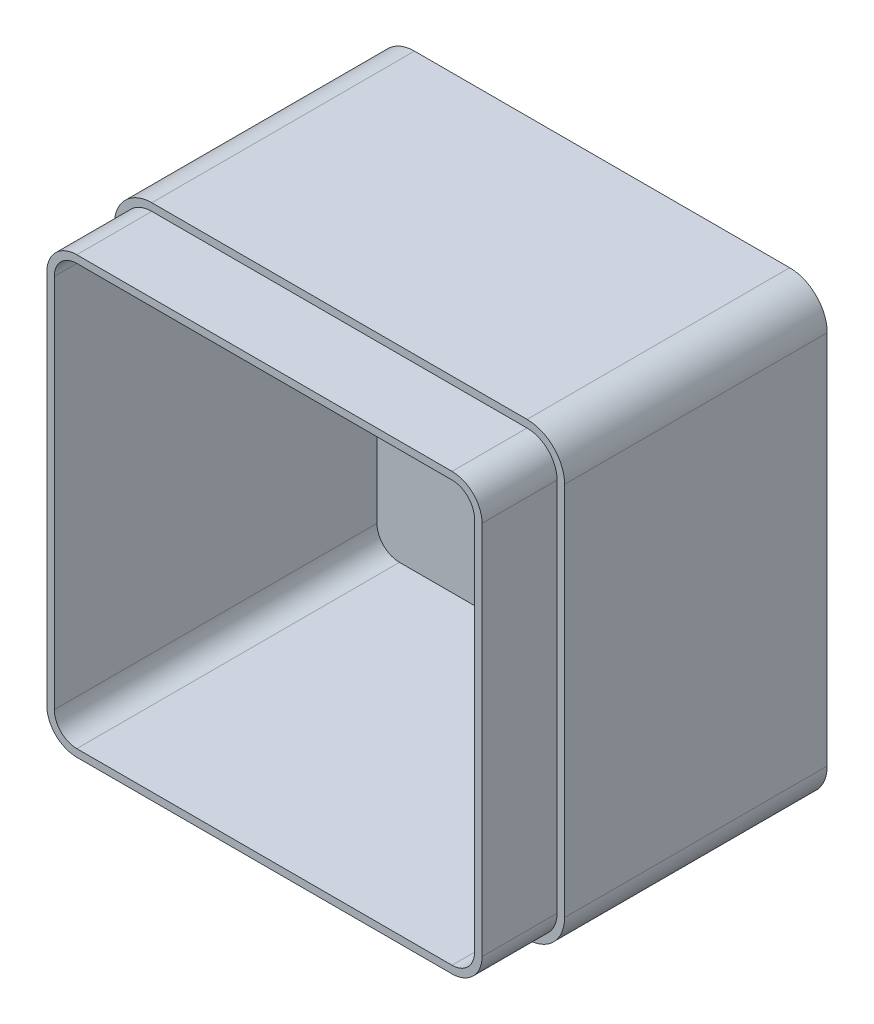
ISO-10303-21;
HEADER;
FILE_DESCRIPTION(('STEP AP214'),'2;1');
FILE_NAME('part.step','',(''),(''),'','','');
FILE_SCHEMA(('AUTOMOTIVE_DESIGN { 1 0 10303 214 1 1 1 1 }'));
ENDSEC;
DATA;
#1=APPLICATION_CONTEXT('core data for automotive mechanical design processes');
#2=APPLICATION_PROTOCOL_DEFINITION('international standard','automotive_design',2000,#1);
#3=PRODUCT_CONTEXT('',#1,'mechanical');
#4=PRODUCT('Part','Part','',(#3));
#5=PRODUCT_RELATED_PRODUCT_CATEGORY('part','',(#4));
#6=PRODUCT_DEFINITION_FORMATION('','',#4);
#7=PRODUCT_DEFINITION_CONTEXT('part definition',#1,'design');
#8=PRODUCT_DEFINITION('design','',#6,#7);
#9=PRODUCT_DEFINITION_SHAPE('','',#8);
#10=(LENGTH_UNIT() NAMED_UNIT(*) SI_UNIT(.MILLI.,.METRE.));
#11=(NAMED_UNIT(*) PLANE_ANGLE_UNIT() SI_UNIT($,.RADIAN.));
#12=(NAMED_UNIT(*) SI_UNIT($,.STERADIAN.) SOLID_ANGLE_UNIT());
#13=UNCERTAINTY_MEASURE_WITH_UNIT(LENGTH_MEASURE(1.E-05),#10,'distance_accuracy_value','');
#14=(GEOMETRIC_REPRESENTATION_CONTEXT(3) GLOBAL_UNCERTAINTY_ASSIGNED_CONTEXT((#13)) GLOBAL_UNIT_ASSIGNED_CONTEXT((#10,
#11,#12)) REPRESENTATION_CONTEXT('',''));
#15=CARTESIAN_POINT('',(0.,0.,0.));
#16=DIRECTION('',(0.,0.,1.));
#17=DIRECTION('',(1.,0.,0.));
#18=AXIS2_PLACEMENT_3D('',#15,#16,#17);
#19=CARTESIAN_POINT('',(0.,0.,90.));
#20=DIRECTION('',(0.,0.,-1.));
#21=DIRECTION('',(-1.,0.,0.));
#22=AXIS2_PLACEMENT_3D('',#19,#20,#21);
#23=PLANE('',#22);
#24=DIRECTION('',(0.,-1.,0.));
#25=VECTOR('',#24,1.);
#26=CARTESIAN_POINT('',(4.,0.,90.));
#27=LINE('',#26,#25);
#28=CARTESIAN_POINT('',(4.,110.,90.));
#29=VERTEX_POINT('',#28);
#30=CARTESIAN_POINT('',(4.,9.99999999999999,90.));
#31=VERTEX_POINT('',#30);
#32=EDGE_CURVE('E369',#29,#31,#27,.T.);
#33=ORIENTED_EDGE('',*,*,#32,.F.);
#34=CARTESIAN_POINT('',(10.,110.,90.));
#35=DIRECTION('',(0.,0.,-1.));
#36=DIRECTION('',(-1.,0.,0.));
#37=AXIS2_PLACEMENT_3D('',#34,#35,#36);
#38=CIRCLE('',#37,6.);
#39=CARTESIAN_POINT('',(9.99999999999999,116.,90.));
#40=VERTEX_POINT('',#39);
#41=EDGE_CURVE('E409',#40,#29,#38,.F.);
#42=ORIENTED_EDGE('',*,*,#41,.F.);
#43=DIRECTION('',(-1.,0.,0.));
#44=VECTOR('',#43,1.);
#45=CARTESIAN_POINT('',(0.,116.,90.));
#46=LINE('',#45,#44);
#47=CARTESIAN_POINT('',(110.,116.,90.));
#48=VERTEX_POINT('',#47);
#49=EDGE_CURVE('E385',#48,#40,#46,.T.);
#50=ORIENTED_EDGE('',*,*,#49,.F.);
#51=CARTESIAN_POINT('',(110.,110.,90.));
#52=DIRECTION('',(0.,0.,-1.));
#53=DIRECTION('',(-1.,0.,0.));
#54=AXIS2_PLACEMENT_3D('',#51,#52,#53);
#55=CIRCLE('',#54,6.);
#56=CARTESIAN_POINT('',(116.,110.,90.));
#57=VERTEX_POINT('',#56);
#58=EDGE_CURVE('E416',#57,#48,#55,.F.);
#59=ORIENTED_EDGE('',*,*,#58,.F.);
#60=DIRECTION('',(0.,1.,0.));
#61=VECTOR('',#60,1.);
#62=CARTESIAN_POINT('',(116.,0.,90.));
#63=LINE('',#62,#61);
#64=CARTESIAN_POINT('',(116.,9.99999999999999,90.));
#65=VERTEX_POINT('',#64);
#66=EDGE_CURVE('E413',#65,#57,#63,.T.);
#67=ORIENTED_EDGE('',*,*,#66,.F.);
#68=CARTESIAN_POINT('',(110.,10.,90.));
#69=DIRECTION('',(0.,0.,-1.));
#70=DIRECTION('',(-1.,0.,0.));
#71=AXIS2_PLACEMENT_3D('',#68,#69,#70);
#72=CIRCLE('',#71,6.);
#73=CARTESIAN_POINT('',(110.,4.,90.));
#74=VERTEX_POINT('',#73);
#75=EDGE_CURVE('E349',#74,#65,#72,.F.);
#76=ORIENTED_EDGE('',*,*,#75,.F.);
#77=DIRECTION('',(1.,0.,0.));
#78=VECTOR('',#77,1.);
#79=CARTESIAN_POINT('',(0.,4.,90.));
#80=LINE('',#79,#78);
#81=CARTESIAN_POINT('',(9.99999999999999,4.,90.));
#82=VERTEX_POINT('',#81);
#83=EDGE_CURVE('E406',#82,#74,#80,.T.);
#84=ORIENTED_EDGE('',*,*,#83,.F.);
#85=CARTESIAN_POINT('',(10.,10.,90.));
#86=DIRECTION('',(0.,0.,-1.));
#87=DIRECTION('',(-1.,0.,0.));
#88=AXIS2_PLACEMENT_3D('',#85,#86,#87);
#89=CIRCLE('',#88,6.);
#90=EDGE_CURVE('E399',#31,#82,#89,.F.);
#91=ORIENTED_EDGE('',*,*,#90,.F.);
#92=EDGE_LOOP('',(#33,#42,#50,#59,#67,#76,#84,#91));
#93=FACE_BOUND('',#92,.T.);
#94=CARTESIAN_POINT('',(10.,110.,90.));
#95=DIRECTION('',(0.,0.,1.));
#96=DIRECTION('',(1.,0.,0.));
#97=AXIS2_PLACEMENT_3D('',#94,#95,#96);
#98=CIRCLE('',#97,8.);
#99=CARTESIAN_POINT('',(9.99999999999999,118.,90.));
#100=VERTEX_POINT('',#99);
#101=CARTESIAN_POINT('',(2.,110.,90.));
#102=VERTEX_POINT('',#101);
#103=EDGE_CURVE('E277',#100,#102,#98,.T.);
#104=ORIENTED_EDGE('',*,*,#103,.T.);
#105=DIRECTION('',(0.,-1.,0.));
#106=VECTOR('',#105,1.);
#107=CARTESIAN_POINT('',(2.,110.,90.));
#108=LINE('',#107,#106);
#109=CARTESIAN_POINT('',(2.,9.99999999999999,90.));
#110=VERTEX_POINT('',#109);
#111=EDGE_CURVE('E227',#102,#110,#108,.T.);
#112=ORIENTED_EDGE('',*,*,#111,.T.);
#113=CARTESIAN_POINT('',(10.,10.,90.));
#114=DIRECTION('',(0.,0.,1.));
#115=DIRECTION('',(1.,0.,0.));
#116=AXIS2_PLACEMENT_3D('',#113,#114,#115);
#117=CIRCLE('',#116,8.);
#118=CARTESIAN_POINT('',(9.99999999999999,2.,90.));
#119=VERTEX_POINT('',#118);
#120=EDGE_CURVE('E75',#110,#119,#117,.T.);
#121=ORIENTED_EDGE('',*,*,#120,.T.);
#122=DIRECTION('',(1.,0.,0.));
#123=VECTOR('',#122,1.);
#124=CARTESIAN_POINT('',(10.,2.,90.));
#125=LINE('',#124,#123);
#126=CARTESIAN_POINT('',(110.,2.,90.));
#127=VERTEX_POINT('',#126);
#128=EDGE_CURVE('E284',#119,#127,#125,.T.);
#129=ORIENTED_EDGE('',*,*,#128,.T.);
#130=CARTESIAN_POINT('',(110.,10.,90.));
#131=DIRECTION('',(0.,0.,1.));
#132=DIRECTION('',(1.,0.,0.));
#133=AXIS2_PLACEMENT_3D('',#130,#131,#132);
#134=CIRCLE('',#133,7.99999999999999);
#135=CARTESIAN_POINT('',(118.,10.,90.));
#136=VERTEX_POINT('',#135);
#137=EDGE_CURVE('E288',#127,#136,#134,.T.);
#138=ORIENTED_EDGE('',*,*,#137,.T.);
#139=DIRECTION('',(0.,1.,0.));
#140=VECTOR('',#139,1.);
#141=CARTESIAN_POINT('',(118.,10.,90.));
#142=LINE('',#141,#140);
#143=CARTESIAN_POINT('',(118.,110.,90.));
#144=VERTEX_POINT('',#143);
#145=EDGE_CURVE('E292',#136,#144,#142,.T.);
#146=ORIENTED_EDGE('',*,*,#145,.T.);
#147=CARTESIAN_POINT('',(110.,110.,90.));
#148=DIRECTION('',(0.,0.,1.));
#149=DIRECTION('',(1.,0.,0.));
#150=AXIS2_PLACEMENT_3D('',#147,#148,#149);
#151=CIRCLE('',#150,7.99999999999999);
#152=CARTESIAN_POINT('',(110.,118.,90.));
#153=VERTEX_POINT('',#152);
#154=EDGE_CURVE('E254',#144,#153,#151,.T.);
#155=ORIENTED_EDGE('',*,*,#154,.T.);
#156=DIRECTION('',(-1.,0.,0.));
#157=VECTOR('',#156,1.);
#158=CARTESIAN_POINT('',(110.,118.,90.));
#159=LINE('',#158,#157);
#160=EDGE_CURVE('E250',#153,#100,#159,.T.);
#161=ORIENTED_EDGE('',*,*,#160,.T.);
#162=EDGE_LOOP('',(#104,#112,#121,#129,#138,#146,#155,#161));
#163=FACE_BOUND('',#162,.T.);
#164=ADVANCED_FACE('F59',(#93,#163),#23,.F.);
#165=CARTESIAN_POINT('',(4.,0.,90.));
#166=DIRECTION('',(1.,0.,0.));
#167=DIRECTION('',(0.,0.,-1.));
#168=AXIS2_PLACEMENT_3D('',#165,#166,#167);
#169=PLANE('',#168);
#170=DIRECTION('',(0.,-1.,0.));
#171=VECTOR('',#170,1.);
#172=CARTESIAN_POINT('',(4.,0.,4.));
#173=LINE('',#172,#171);
#174=CARTESIAN_POINT('',(4.,110.,4.));
#175=VERTEX_POINT('',#174);
#176=CARTESIAN_POINT('',(4.,9.99999999999999,4.));
#177=VERTEX_POINT('',#176);
#178=EDGE_CURVE('E341',#175,#177,#173,.T.);
#179=ORIENTED_EDGE('',*,*,#178,.F.);
#180=DIRECTION('',(0.,0.,-1.));
#181=VECTOR('',#180,1.);
#182=CARTESIAN_POINT('',(4.,110.,90.));
#183=LINE('',#182,#181);
#184=EDGE_CURVE('E350',#29,#175,#183,.T.);
#185=ORIENTED_EDGE('',*,*,#184,.F.);
#186=ORIENTED_EDGE('',*,*,#32,.T.);
#187=DIRECTION('',(0.,0.,-1.));
#188=VECTOR('',#187,1.);
#189=CARTESIAN_POINT('',(4.,9.99999999999999,90.));
#190=LINE('',#189,#188);
#191=EDGE_CURVE('E346',#177,#31,#190,.F.);
#192=ORIENTED_EDGE('',*,*,#191,.F.);
#193=EDGE_LOOP('',(#179,#185,#186,#192));
#194=FACE_BOUND('',#193,.T.);
#195=ADVANCED_FACE('F523',(#194),#169,.T.);
#196=CARTESIAN_POINT('',(0.,4.,90.));
#197=DIRECTION('',(0.,1.,0.));
#198=DIRECTION('',(0.,0.,1.));
#199=AXIS2_PLACEMENT_3D('',#196,#197,#198);
#200=PLANE('',#199);
#201=ORIENTED_EDGE('',*,*,#83,.T.);
#202=DIRECTION('',(0.,0.,1.));
#203=VECTOR('',#202,1.);
#204=CARTESIAN_POINT('',(110.,4.,90.));
#205=LINE('',#204,#203);
#206=CARTESIAN_POINT('',(110.,4.,4.));
#207=VERTEX_POINT('',#206);
#208=EDGE_CURVE('E382',#207,#74,#205,.T.);
#209=ORIENTED_EDGE('',*,*,#208,.F.);
#210=DIRECTION('',(1.,0.,0.));
#211=VECTOR('',#210,1.);
#212=CARTESIAN_POINT('',(0.,4.,4.));
#213=LINE('',#212,#211);
#214=CARTESIAN_POINT('',(9.99999999999999,4.,4.));
#215=VERTEX_POINT('',#214);
#216=EDGE_CURVE('E345',#215,#207,#213,.T.);
#217=ORIENTED_EDGE('',*,*,#216,.F.);
#218=DIRECTION('',(0.,0.,1.));
#219=VECTOR('',#218,1.);
#220=CARTESIAN_POINT('',(9.99999999999999,4.,90.));
#221=LINE('',#220,#219);
#222=EDGE_CURVE('E378',#82,#215,#221,.F.);
#223=ORIENTED_EDGE('',*,*,#222,.F.);
#224=EDGE_LOOP('',(#201,#209,#217,#223));
#225=FACE_BOUND('',#224,.T.);
#226=ADVANCED_FACE('F529',(#225),#200,.T.);
#227=CARTESIAN_POINT('',(116.,0.,90.));
#228=DIRECTION('',(-1.,0.,0.));
#229=DIRECTION('',(0.,0.,1.));
#230=AXIS2_PLACEMENT_3D('',#227,#228,#229);
#231=PLANE('',#230);
#232=DIRECTION('',(0.,1.,0.));
#233=VECTOR('',#232,1.);
#234=CARTESIAN_POINT('',(116.,0.,4.));
#235=LINE('',#234,#233);
#236=CARTESIAN_POINT('',(116.,9.99999999999999,4.));
#237=VERTEX_POINT('',#236);
#238=CARTESIAN_POINT('',(116.,110.,4.));
#239=VERTEX_POINT('',#238);
#240=EDGE_CURVE('E358',#237,#239,#235,.T.);
#241=ORIENTED_EDGE('',*,*,#240,.F.);
#242=DIRECTION('',(0.,0.,1.));
#243=VECTOR('',#242,1.);
#244=CARTESIAN_POINT('',(116.,9.99999999999999,90.));
#245=LINE('',#244,#243);
#246=EDGE_CURVE('E386',#65,#237,#245,.F.);
#247=ORIENTED_EDGE('',*,*,#246,.F.);
#248=ORIENTED_EDGE('',*,*,#66,.T.);
#249=DIRECTION('',(0.,0.,1.));
#250=VECTOR('',#249,1.);
#251=CARTESIAN_POINT('',(116.,110.,90.));
#252=LINE('',#251,#250);
#253=EDGE_CURVE('E390',#239,#57,#252,.T.);
#254=ORIENTED_EDGE('',*,*,#253,.F.);
#255=EDGE_LOOP('',(#241,#247,#248,#254));
#256=FACE_BOUND('',#255,.T.);
#257=ADVANCED_FACE('F676',(#256),#231,.T.);
#258=CARTESIAN_POINT('',(0.,116.,90.));
#259=DIRECTION('',(0.,-1.,0.));
#260=DIRECTION('',(0.,0.,-1.));
#261=AXIS2_PLACEMENT_3D('',#258,#259,#260);
#262=PLANE('',#261);
#263=DIRECTION('',(-1.,0.,0.));
#264=VECTOR('',#263,1.);
#265=CARTESIAN_POINT('',(0.,116.,4.));
#266=LINE('',#265,#264);
#267=CARTESIAN_POINT('',(110.,116.,4.));
#268=VERTEX_POINT('',#267);
#269=CARTESIAN_POINT('',(9.99999999999999,116.,4.));
#270=VERTEX_POINT('',#269);
#271=EDGE_CURVE('E365',#268,#270,#266,.T.);
#272=ORIENTED_EDGE('',*,*,#271,.F.);
#273=DIRECTION('',(0.,0.,-1.));
#274=VECTOR('',#273,1.);
#275=CARTESIAN_POINT('',(110.,116.,90.));
#276=LINE('',#275,#274);
#277=EDGE_CURVE('E395',#48,#268,#276,.T.);
#278=ORIENTED_EDGE('',*,*,#277,.F.);
#279=ORIENTED_EDGE('',*,*,#49,.T.);
#280=DIRECTION('',(0.,0.,-1.));
#281=VECTOR('',#280,1.);
#282=CARTESIAN_POINT('',(9.99999999999999,116.,90.));
#283=LINE('',#282,#281);
#284=EDGE_CURVE('E391',#270,#40,#283,.F.);
#285=ORIENTED_EDGE('',*,*,#284,.F.);
#286=EDGE_LOOP('',(#272,#278,#279,#285));
#287=FACE_BOUND('',#286,.T.);
#288=ADVANCED_FACE('F668',(#287),#262,.T.);
#289=CARTESIAN_POINT('',(0.,0.,4.));
#290=DIRECTION('',(0.,0.,-1.));
#291=DIRECTION('',(-1.,0.,0.));
#292=AXIS2_PLACEMENT_3D('',#289,#290,#291);
#293=PLANE('',#292);
#294=ORIENTED_EDGE('',*,*,#216,.T.);
#295=CARTESIAN_POINT('',(110.,10.,4.));
#296=DIRECTION('',(0.,0.,-1.));
#297=DIRECTION('',(-1.,0.,0.));
#298=AXIS2_PLACEMENT_3D('',#295,#296,#297);
#299=CIRCLE('',#298,6.);
#300=EDGE_CURVE('E372',#237,#207,#299,.T.);
#301=ORIENTED_EDGE('',*,*,#300,.F.);
#302=ORIENTED_EDGE('',*,*,#240,.T.);
#303=CARTESIAN_POINT('',(110.,110.,4.));
#304=DIRECTION('',(0.,0.,-1.));
#305=DIRECTION('',(-1.,0.,0.));
#306=AXIS2_PLACEMENT_3D('',#303,#304,#305);
#307=CIRCLE('',#306,6.);
#308=EDGE_CURVE('E364',#268,#239,#307,.T.);
#309=ORIENTED_EDGE('',*,*,#308,.F.);
#310=ORIENTED_EDGE('',*,*,#271,.T.);
#311=CARTESIAN_POINT('',(10.,110.,4.));
#312=DIRECTION('',(0.,0.,-1.));
#313=DIRECTION('',(-1.,0.,0.));
#314=AXIS2_PLACEMENT_3D('',#311,#312,#313);
#315=CIRCLE('',#314,6.);
#316=EDGE_CURVE('E361',#175,#270,#315,.T.);
#317=ORIENTED_EDGE('',*,*,#316,.F.);
#318=ORIENTED_EDGE('',*,*,#178,.T.);
#319=CARTESIAN_POINT('',(10.,10.,4.));
#320=DIRECTION('',(0.,0.,-1.));
#321=DIRECTION('',(-1.,0.,0.));
#322=AXIS2_PLACEMENT_3D('',#319,#320,#321);
#323=CIRCLE('',#322,6.);
#324=EDGE_CURVE('E354',#215,#177,#323,.T.);
#325=ORIENTED_EDGE('',*,*,#324,.F.);
#326=EDGE_LOOP('',(#294,#301,#302,#309,#310,#317,#318,#325));
#327=FACE_BOUND('',#326,.T.);
#328=ADVANCED_FACE('F660',(#327),#293,.F.);
#329=CARTESIAN_POINT('',(10.,10.,90.));
#330=DIRECTION('',(0.,0.,-1.));
#331=DIRECTION('',(-1.,0.,0.));
#332=AXIS2_PLACEMENT_3D('',#329,#330,#331);
#333=CYLINDRICAL_SURFACE('',#332,6.);
#334=ORIENTED_EDGE('',*,*,#90,.T.);
#335=ORIENTED_EDGE('',*,*,#222,.T.);
#336=ORIENTED_EDGE('',*,*,#324,.T.);
#337=ORIENTED_EDGE('',*,*,#191,.T.);
#338=EDGE_LOOP('',(#334,#335,#336,#337));
#339=FACE_BOUND('',#338,.T.);
#340=ADVANCED_FACE('F652',(#339),#333,.F.);
#341=CARTESIAN_POINT('',(10.,110.,90.));
#342=DIRECTION('',(0.,0.,-1.));
#343=DIRECTION('',(-1.,0.,0.));
#344=AXIS2_PLACEMENT_3D('',#341,#342,#343);
#345=CYLINDRICAL_SURFACE('',#344,6.);
#346=ORIENTED_EDGE('',*,*,#41,.T.);
#347=ORIENTED_EDGE('',*,*,#184,.T.);
#348=ORIENTED_EDGE('',*,*,#316,.T.);
#349=ORIENTED_EDGE('',*,*,#284,.T.);
#350=EDGE_LOOP('',(#346,#347,#348,#349));
#351=FACE_BOUND('',#350,.T.);
#352=ADVANCED_FACE('F645',(#351),#345,.F.);
#353=CARTESIAN_POINT('',(110.,110.,90.));
#354=DIRECTION('',(0.,0.,-1.));
#355=DIRECTION('',(-1.,0.,0.));
#356=AXIS2_PLACEMENT_3D('',#353,#354,#355);
#357=CYLINDRICAL_SURFACE('',#356,6.);
#358=ORIENTED_EDGE('',*,*,#58,.T.);
#359=ORIENTED_EDGE('',*,*,#277,.T.);
#360=ORIENTED_EDGE('',*,*,#308,.T.);
#361=ORIENTED_EDGE('',*,*,#253,.T.);
#362=EDGE_LOOP('',(#358,#359,#360,#361));
#363=FACE_BOUND('',#362,.T.);
#364=ADVANCED_FACE('F638',(#363),#357,.F.);
#365=CARTESIAN_POINT('',(110.,10.,90.));
#366=DIRECTION('',(0.,0.,-1.));
#367=DIRECTION('',(-1.,0.,0.));
#368=AXIS2_PLACEMENT_3D('',#365,#366,#367);
#369=CYLINDRICAL_SURFACE('',#368,6.);
#370=ORIENTED_EDGE('',*,*,#75,.T.);
#371=ORIENTED_EDGE('',*,*,#246,.T.);
#372=ORIENTED_EDGE('',*,*,#300,.T.);
#373=ORIENTED_EDGE('',*,*,#208,.T.);
#374=EDGE_LOOP('',(#370,#371,#372,#373));
#375=FACE_BOUND('',#374,.T.);
#376=ADVANCED_FACE('F536',(#375),#369,.F.);
#377=CARTESIAN_POINT('',(10.,110.,70.));
#378=DIRECTION('',(0.,0.,1.));
#379=DIRECTION('',(1.,0.,0.));
#380=AXIS2_PLACEMENT_3D('',#377,#378,#379);
#381=PLANE('',#380);
#382=DIRECTION('',(-1.,0.,0.));
#383=VECTOR('',#382,1.);
#384=CARTESIAN_POINT('',(110.,118.,70.));
#385=LINE('',#384,#383);
#386=CARTESIAN_POINT('',(110.,118.,70.));
#387=VERTEX_POINT('',#386);
#388=CARTESIAN_POINT('',(9.99999999999999,118.,70.));
#389=VERTEX_POINT('',#388);
#390=EDGE_CURVE('E234',#387,#389,#385,.T.);
#391=ORIENTED_EDGE('',*,*,#390,.F.);
#392=CARTESIAN_POINT('',(110.,110.,70.));
#393=DIRECTION('',(0.,0.,1.));
#394=DIRECTION('',(1.,0.,0.));
#395=AXIS2_PLACEMENT_3D('',#392,#393,#394);
#396=CIRCLE('',#395,7.99999999999999);
#397=CARTESIAN_POINT('',(118.,110.,70.));
#398=VERTEX_POINT('',#397);
#399=EDGE_CURVE('E271',#398,#387,#396,.T.);
#400=ORIENTED_EDGE('',*,*,#399,.F.);
#401=DIRECTION('',(0.,1.,0.));
#402=VECTOR('',#401,1.);
#403=CARTESIAN_POINT('',(118.,10.,70.));
#404=LINE('',#403,#402);
#405=CARTESIAN_POINT('',(118.,10.,70.));
#406=VERTEX_POINT('',#405);
#407=EDGE_CURVE('E267',#406,#398,#404,.T.);
#408=ORIENTED_EDGE('',*,*,#407,.F.);
#409=CARTESIAN_POINT('',(110.,10.,70.));
#410=DIRECTION('',(0.,0.,1.));
#411=DIRECTION('',(1.,0.,0.));
#412=AXIS2_PLACEMENT_3D('',#409,#410,#411);
#413=CIRCLE('',#412,7.99999999999999);
#414=CARTESIAN_POINT('',(110.,2.,70.));
#415=VERTEX_POINT('',#414);
#416=EDGE_CURVE('E263',#415,#406,#413,.T.);
#417=ORIENTED_EDGE('',*,*,#416,.F.);
#418=DIRECTION('',(1.,0.,0.));
#419=VECTOR('',#418,1.);
#420=CARTESIAN_POINT('',(10.,2.,70.));
#421=LINE('',#420,#419);
#422=CARTESIAN_POINT('',(9.99999999999999,2.,70.));
#423=VERTEX_POINT('',#422);
#424=EDGE_CURVE('E259',#423,#415,#421,.T.);
#425=ORIENTED_EDGE('',*,*,#424,.F.);
#426=CARTESIAN_POINT('',(10.,10.,70.));
#427=DIRECTION('',(0.,0.,1.));
#428=DIRECTION('',(1.,0.,0.));
#429=AXIS2_PLACEMENT_3D('',#426,#427,#428);
#430=CIRCLE('',#429,8.);
#431=CARTESIAN_POINT('',(2.,9.99999999999999,70.));
#432=VERTEX_POINT('',#431);
#433=EDGE_CURVE('E244',#432,#423,#430,.T.);
#434=ORIENTED_EDGE('',*,*,#433,.F.);
#435=DIRECTION('',(0.,-1.,0.));
#436=VECTOR('',#435,1.);
#437=CARTESIAN_POINT('',(2.,110.,70.));
#438=LINE('',#437,#436);
#439=CARTESIAN_POINT('',(2.,110.,70.));
#440=VERTEX_POINT('',#439);
#441=EDGE_CURVE('E225',#440,#432,#438,.T.);
#442=ORIENTED_EDGE('',*,*,#441,.F.);
#443=CARTESIAN_POINT('',(10.,110.,70.));
#444=DIRECTION('',(0.,0.,1.));
#445=DIRECTION('',(1.,0.,0.));
#446=AXIS2_PLACEMENT_3D('',#443,#444,#445);
#447=CIRCLE('',#446,8.);
#448=EDGE_CURVE('E240',#389,#440,#447,.T.);
#449=ORIENTED_EDGE('',*,*,#448,.F.);
#450=EDGE_LOOP('',(#391,#400,#408,#417,#425,#434,#442,#449));
#451=FACE_BOUND('',#450,.T.);
#452=CARTESIAN_POINT('',(10.,110.,70.));
#453=DIRECTION('',(0.,0.,1.));
#454=DIRECTION('',(1.,0.,0.));
#455=AXIS2_PLACEMENT_3D('',#452,#453,#454);
#456=CIRCLE('',#455,10.);
#457=CARTESIAN_POINT('',(9.99999999999999,120.,70.));
#458=VERTEX_POINT('',#457);
#459=CARTESIAN_POINT('',(0.,110.,70.));
#460=VERTEX_POINT('',#459);
#461=EDGE_CURVE('E301',#458,#460,#456,.T.);
#462=ORIENTED_EDGE('',*,*,#461,.T.);
#463=DIRECTION('',(0.,-1.,0.));
#464=VECTOR('',#463,1.);
#465=CARTESIAN_POINT('',(0.,110.,70.));
#466=LINE('',#465,#464);
#467=CARTESIAN_POINT('',(0.,10.,70.));
#468=VERTEX_POINT('',#467);
#469=EDGE_CURVE('E321',#460,#468,#466,.T.);
#470=ORIENTED_EDGE('',*,*,#469,.T.);
#471=CARTESIAN_POINT('',(10.,10.,70.));
#472=DIRECTION('',(0.,0.,1.));
#473=DIRECTION('',(1.,0.,0.));
#474=AXIS2_PLACEMENT_3D('',#471,#472,#473);
#475=CIRCLE('',#474,10.);
#476=CARTESIAN_POINT('',(9.99999999999999,0.,70.));
#477=VERTEX_POINT('',#476);
#478=EDGE_CURVE('E324',#468,#477,#475,.T.);
#479=ORIENTED_EDGE('',*,*,#478,.T.);
#480=DIRECTION('',(1.,0.,0.));
#481=VECTOR('',#480,1.);
#482=CARTESIAN_POINT('',(9.99999999999999,0.,70.));
#483=LINE('',#482,#481);
#484=CARTESIAN_POINT('',(110.,0.,70.));
#485=VERTEX_POINT('',#484);
#486=EDGE_CURVE('E83',#477,#485,#483,.T.);
#487=ORIENTED_EDGE('',*,*,#486,.T.);
#488=CARTESIAN_POINT('',(110.,10.,70.));
#489=DIRECTION('',(0.,0.,1.));
#490=DIRECTION('',(1.,0.,0.));
#491=AXIS2_PLACEMENT_3D('',#488,#489,#490);
#492=CIRCLE('',#491,9.99999999999999);
#493=CARTESIAN_POINT('',(120.,10.,70.));
#494=VERTEX_POINT('',#493);
#495=EDGE_CURVE('E329',#485,#494,#492,.T.);
#496=ORIENTED_EDGE('',*,*,#495,.T.);
#497=DIRECTION('',(0.,1.,0.));
#498=VECTOR('',#497,1.);
#499=CARTESIAN_POINT('',(120.,10.,70.));
#500=LINE('',#499,#498);
#501=CARTESIAN_POINT('',(120.,110.,70.));
#502=VERTEX_POINT('',#501);
#503=EDGE_CURVE('E332',#494,#502,#500,.T.);
#504=ORIENTED_EDGE('',*,*,#503,.T.);
#505=CARTESIAN_POINT('',(110.,110.,70.));
#506=DIRECTION('',(0.,0.,1.));
#507=DIRECTION('',(1.,0.,0.));
#508=AXIS2_PLACEMENT_3D('',#505,#506,#507);
#509=CIRCLE('',#508,9.99999999999999);
#510=CARTESIAN_POINT('',(110.,120.,70.));
#511=VERTEX_POINT('',#510);
#512=EDGE_CURVE('E335',#502,#511,#509,.T.);
#513=ORIENTED_EDGE('',*,*,#512,.T.);
#514=DIRECTION('',(-1.,0.,0.));
#515=VECTOR('',#514,1.);
#516=CARTESIAN_POINT('',(110.,120.,70.));
#517=LINE('',#516,#515);
#518=EDGE_CURVE('E338',#511,#458,#517,.T.);
#519=ORIENTED_EDGE('',*,*,#518,.T.);
#520=EDGE_LOOP('',(#462,#470,#479,#487,#496,#504,#513,#519));
#521=FACE_BOUND('',#520,.T.);
#522=ADVANCED_FACE('F239',(#451,#521),#381,.T.);
#523=CARTESIAN_POINT('',(10.,110.,70.));
#524=DIRECTION('',(0.,0.,1.));
#525=DIRECTION('',(1.,0.,0.));
#526=AXIS2_PLACEMENT_3D('',#523,#524,#525);
#527=CYLINDRICAL_SURFACE('',#526,8.);
#528=ORIENTED_EDGE('',*,*,#103,.F.);
#529=DIRECTION('',(0.,0.,1.));
#530=VECTOR('',#529,1.);
#531=CARTESIAN_POINT('',(9.99999999999999,118.,70.));
#532=LINE('',#531,#530);
#533=EDGE_CURVE('E248',#389,#100,#532,.T.);
#534=ORIENTED_EDGE('',*,*,#533,.F.);
#535=ORIENTED_EDGE('',*,*,#448,.T.);
#536=DIRECTION('',(0.,0.,1.));
#537=VECTOR('',#536,1.);
#538=CARTESIAN_POINT('',(2.,110.,70.));
#539=LINE('',#538,#537);
#540=EDGE_CURVE('E222',#440,#102,#539,.T.);
#541=ORIENTED_EDGE('',*,*,#540,.T.);
#542=EDGE_LOOP('',(#528,#534,#535,#541));
#543=FACE_BOUND('',#542,.T.);
#544=ADVANCED_FACE('F247',(#543),#527,.T.);
#545=CARTESIAN_POINT('',(110.,118.,70.));
#546=DIRECTION('',(0.,1.,0.));
#547=DIRECTION('',(0.,0.,1.));
#548=AXIS2_PLACEMENT_3D('',#545,#546,#547);
#549=PLANE('',#548);
#550=ORIENTED_EDGE('',*,*,#160,.F.);
#551=DIRECTION('',(0.,0.,1.));
#552=VECTOR('',#551,1.);
#553=CARTESIAN_POINT('',(110.,118.,70.));
#554=LINE('',#553,#552);
#555=EDGE_CURVE('E302',#387,#153,#554,.T.);
#556=ORIENTED_EDGE('',*,*,#555,.F.);
#557=ORIENTED_EDGE('',*,*,#390,.T.);
#558=ORIENTED_EDGE('',*,*,#533,.T.);
#559=EDGE_LOOP('',(#550,#556,#557,#558));
#560=FACE_BOUND('',#559,.T.);
#561=ADVANCED_FACE('F611',(#560),#549,.T.);
#562=CARTESIAN_POINT('',(110.,110.,70.));
#563=DIRECTION('',(0.,0.,1.));
#564=DIRECTION('',(1.,0.,0.));
#565=AXIS2_PLACEMENT_3D('',#562,#563,#564);
#566=CYLINDRICAL_SURFACE('',#565,7.99999999999999);
#567=ORIENTED_EDGE('',*,*,#154,.F.);
#568=DIRECTION('',(0.,0.,1.));
#569=VECTOR('',#568,1.);
#570=CARTESIAN_POINT('',(118.,110.,70.));
#571=LINE('',#570,#569);
#572=EDGE_CURVE('E305',#398,#144,#571,.T.);
#573=ORIENTED_EDGE('',*,*,#572,.F.);
#574=ORIENTED_EDGE('',*,*,#399,.T.);
#575=ORIENTED_EDGE('',*,*,#555,.T.);
#576=EDGE_LOOP('',(#567,#573,#574,#575));
#577=FACE_BOUND('',#576,.T.);
#578=ADVANCED_FACE('F603',(#577),#566,.T.);
#579=CARTESIAN_POINT('',(118.,10.,70.));
#580=DIRECTION('',(1.,0.,0.));
#581=DIRECTION('',(0.,0.,-1.));
#582=AXIS2_PLACEMENT_3D('',#579,#580,#581);
#583=PLANE('',#582);
#584=ORIENTED_EDGE('',*,*,#145,.F.);
#585=DIRECTION('',(0.,0.,1.));
#586=VECTOR('',#585,1.);
#587=CARTESIAN_POINT('',(118.,10.,70.));
#588=LINE('',#587,#586);
#589=EDGE_CURVE('E308',#406,#136,#588,.T.);
#590=ORIENTED_EDGE('',*,*,#589,.F.);
#591=ORIENTED_EDGE('',*,*,#407,.T.);
#592=ORIENTED_EDGE('',*,*,#572,.T.);
#593=EDGE_LOOP('',(#584,#590,#591,#592));
#594=FACE_BOUND('',#593,.T.);
#595=ADVANCED_FACE('F595',(#594),#583,.T.);
#596=CARTESIAN_POINT('',(110.,10.,70.));
#597=DIRECTION('',(0.,0.,1.));
#598=DIRECTION('',(1.,0.,0.));
#599=AXIS2_PLACEMENT_3D('',#596,#597,#598);
#600=CYLINDRICAL_SURFACE('',#599,7.99999999999999);
#601=ORIENTED_EDGE('',*,*,#137,.F.);
#602=DIRECTION('',(0.,0.,1.));
#603=VECTOR('',#602,1.);
#604=CARTESIAN_POINT('',(110.,2.,70.));
#605=LINE('',#604,#603);
#606=EDGE_CURVE('E311',#415,#127,#605,.T.);
#607=ORIENTED_EDGE('',*,*,#606,.F.);
#608=ORIENTED_EDGE('',*,*,#416,.T.);
#609=ORIENTED_EDGE('',*,*,#589,.T.);
#610=EDGE_LOOP('',(#601,#607,#608,#609));
#611=FACE_BOUND('',#610,.T.);
#612=ADVANCED_FACE('F587',(#611),#600,.T.);
#613=CARTESIAN_POINT('',(10.,2.,70.));
#614=DIRECTION('',(0.,-1.,0.));
#615=DIRECTION('',(0.,0.,-1.));
#616=AXIS2_PLACEMENT_3D('',#613,#614,#615);
#617=PLANE('',#616);
#618=ORIENTED_EDGE('',*,*,#128,.F.);
#619=DIRECTION('',(0.,0.,1.));
#620=VECTOR('',#619,1.);
#621=CARTESIAN_POINT('',(9.99999999999999,2.,70.));
#622=LINE('',#621,#620);
#623=EDGE_CURVE('E314',#423,#119,#622,.T.);
#624=ORIENTED_EDGE('',*,*,#623,.F.);
#625=ORIENTED_EDGE('',*,*,#424,.T.);
#626=ORIENTED_EDGE('',*,*,#606,.T.);
#627=EDGE_LOOP('',(#618,#624,#625,#626));
#628=FACE_BOUND('',#627,.T.);
#629=ADVANCED_FACE('F580',(#628),#617,.T.);
#630=CARTESIAN_POINT('',(10.,10.,70.));
#631=DIRECTION('',(0.,0.,1.));
#632=DIRECTION('',(1.,0.,0.));
#633=AXIS2_PLACEMENT_3D('',#630,#631,#632);
#634=CYLINDRICAL_SURFACE('',#633,8.);
#635=ORIENTED_EDGE('',*,*,#120,.F.);
#636=DIRECTION('',(0.,0.,1.));
#637=VECTOR('',#636,1.);
#638=CARTESIAN_POINT('',(2.,9.99999999999999,70.));
#639=LINE('',#638,#637);
#640=EDGE_CURVE('E233',#432,#110,#639,.T.);
#641=ORIENTED_EDGE('',*,*,#640,.F.);
#642=ORIENTED_EDGE('',*,*,#433,.T.);
#643=ORIENTED_EDGE('',*,*,#623,.T.);
#644=EDGE_LOOP('',(#635,#641,#642,#643));
#645=FACE_BOUND('',#644,.T.);
#646=ADVANCED_FACE('F573',(#645),#634,.T.);
#647=CARTESIAN_POINT('',(2.,110.,70.));
#648=DIRECTION('',(-1.,0.,0.));
#649=DIRECTION('',(0.,0.,1.));
#650=AXIS2_PLACEMENT_3D('',#647,#648,#649);
#651=PLANE('',#650);
#652=ORIENTED_EDGE('',*,*,#111,.F.);
#653=ORIENTED_EDGE('',*,*,#540,.F.);
#654=ORIENTED_EDGE('',*,*,#441,.T.);
#655=ORIENTED_EDGE('',*,*,#640,.T.);
#656=EDGE_LOOP('',(#652,#653,#654,#655));
#657=FACE_BOUND('',#656,.T.);
#658=ADVANCED_FACE('F224',(#657),#651,.T.);
#659=CARTESIAN_POINT('',(0.,0.,0.));
#660=DIRECTION('',(0.,0.,-1.));
#661=DIRECTION('',(-1.,0.,0.));
#662=AXIS2_PLACEMENT_3D('',#659,#660,#661);
#663=PLANE('',#662);
#664=DIRECTION('',(1.,0.,0.));
#665=VECTOR('',#664,1.);
#666=CARTESIAN_POINT('',(0.,0.,0.));
#667=LINE('',#666,#665);
#668=CARTESIAN_POINT('',(9.99999999999999,0.,0.));
#669=VERTEX_POINT('',#668);
#670=CARTESIAN_POINT('',(110.,0.,0.));
#671=VERTEX_POINT('',#670);
#672=EDGE_CURVE('E429',#669,#671,#667,.T.);
#673=ORIENTED_EDGE('',*,*,#672,.F.);
#674=CARTESIAN_POINT('',(10.,10.,0.));
#675=DIRECTION('',(0.,0.,-1.));
#676=DIRECTION('',(-1.,0.,0.));
#677=AXIS2_PLACEMENT_3D('',#674,#675,#676);
#678=CIRCLE('',#677,10.);
#679=CARTESIAN_POINT('',(0.,10.,0.));
#680=VERTEX_POINT('',#679);
#681=EDGE_CURVE('E457',#669,#680,#678,.T.);
#682=ORIENTED_EDGE('',*,*,#681,.T.);
#683=DIRECTION('',(0.,-1.,0.));
#684=VECTOR('',#683,1.);
#685=CARTESIAN_POINT('',(0.,0.,0.));
#686=LINE('',#685,#684);
#687=CARTESIAN_POINT('',(0.,110.,0.));
#688=VERTEX_POINT('',#687);
#689=EDGE_CURVE('E394',#688,#680,#686,.T.);
#690=ORIENTED_EDGE('',*,*,#689,.F.);
#691=CARTESIAN_POINT('',(10.,110.,0.));
#692=DIRECTION('',(0.,0.,-1.));
#693=DIRECTION('',(-1.,0.,0.));
#694=AXIS2_PLACEMENT_3D('',#691,#692,#693);
#695=CIRCLE('',#694,10.);
#696=CARTESIAN_POINT('',(9.99999999999999,120.,0.));
#697=VERTEX_POINT('',#696);
#698=EDGE_CURVE('E454',#688,#697,#695,.T.);
#699=ORIENTED_EDGE('',*,*,#698,.T.);
#700=DIRECTION('',(-1.,0.,0.));
#701=VECTOR('',#700,1.);
#702=CARTESIAN_POINT('',(0.,120.,0.));
#703=LINE('',#702,#701);
#704=CARTESIAN_POINT('',(110.,120.,0.));
#705=VERTEX_POINT('',#704);
#706=EDGE_CURVE('E437',#705,#697,#703,.T.);
#707=ORIENTED_EDGE('',*,*,#706,.F.);
#708=CARTESIAN_POINT('',(110.,110.,0.));
#709=DIRECTION('',(0.,0.,-1.));
#710=DIRECTION('',(-1.,0.,0.));
#711=AXIS2_PLACEMENT_3D('',#708,#709,#710);
#712=CIRCLE('',#711,10.);
#713=CARTESIAN_POINT('',(120.,110.,0.));
#714=VERTEX_POINT('',#713);
#715=EDGE_CURVE('E451',#705,#714,#712,.T.);
#716=ORIENTED_EDGE('',*,*,#715,.T.);
#717=DIRECTION('',(0.,1.,0.));
#718=VECTOR('',#717,1.);
#719=CARTESIAN_POINT('',(120.,0.,0.));
#720=LINE('',#719,#718);
#721=CARTESIAN_POINT('',(120.,10.,0.));
#722=VERTEX_POINT('',#721);
#723=EDGE_CURVE('E433',#722,#714,#720,.T.);
#724=ORIENTED_EDGE('',*,*,#723,.F.);
#725=CARTESIAN_POINT('',(110.,10.,0.));
#726=DIRECTION('',(0.,0.,-1.));
#727=DIRECTION('',(-1.,0.,0.));
#728=AXIS2_PLACEMENT_3D('',#725,#726,#727);
#729=CIRCLE('',#728,10.);
#730=EDGE_CURVE('E448',#722,#671,#729,.T.);
#731=ORIENTED_EDGE('',*,*,#730,.T.);
#732=EDGE_LOOP('',(#673,#682,#690,#699,#707,#716,#724,#731));
#733=FACE_BOUND('',#732,.T.);
#734=ADVANCED_FACE('F485',(#733),#663,.T.);
#735=CARTESIAN_POINT('',(10.,110.,90.));
#736=DIRECTION('',(0.,0.,-1.));
#737=DIRECTION('',(-1.,0.,0.));
#738=AXIS2_PLACEMENT_3D('',#735,#736,#737);
#739=CYLINDRICAL_SURFACE('',#738,10.);
#740=DIRECTION('',(0.,0.,-1.));
#741=VECTOR('',#740,1.);
#742=CARTESIAN_POINT('',(0.,110.,90.));
#743=LINE('',#742,#741);
#744=EDGE_CURVE('E460',#460,#688,#743,.T.);
#745=ORIENTED_EDGE('',*,*,#744,.F.);
#746=ORIENTED_EDGE('',*,*,#461,.F.);
#747=DIRECTION('',(0.,0.,-1.));
#748=VECTOR('',#747,1.);
#749=CARTESIAN_POINT('',(10.,120.,90.));
#750=LINE('',#749,#748);
#751=EDGE_CURVE('E470',#697,#458,#750,.F.);
#752=ORIENTED_EDGE('',*,*,#751,.F.);
#753=ORIENTED_EDGE('',*,*,#698,.F.);
#754=EDGE_LOOP('',(#745,#746,#752,#753));
#755=FACE_BOUND('',#754,.T.);
#756=ADVANCED_FACE('F500',(#755),#739,.T.);
#757=CARTESIAN_POINT('',(110.,110.,90.));
#758=DIRECTION('',(0.,0.,-1.));
#759=DIRECTION('',(-1.,0.,0.));
#760=AXIS2_PLACEMENT_3D('',#757,#758,#759);
#761=CYLINDRICAL_SURFACE('',#760,10.);
#762=DIRECTION('',(0.,0.,-1.));
#763=VECTOR('',#762,1.);
#764=CARTESIAN_POINT('',(110.,120.,90.));
#765=LINE('',#764,#763);
#766=EDGE_CURVE('E467',#511,#705,#765,.T.);
#767=ORIENTED_EDGE('',*,*,#766,.F.);
#768=ORIENTED_EDGE('',*,*,#512,.F.);
#769=DIRECTION('',(0.,0.,-1.));
#770=VECTOR('',#769,1.);
#771=CARTESIAN_POINT('',(120.,110.,90.));
#772=LINE('',#771,#770);
#773=EDGE_CURVE('E12',#714,#502,#772,.F.);
#774=ORIENTED_EDGE('',*,*,#773,.F.);
#775=ORIENTED_EDGE('',*,*,#715,.F.);
#776=EDGE_LOOP('',(#767,#768,#774,#775));
#777=FACE_BOUND('',#776,.T.);
#778=ADVANCED_FACE('F490',(#777),#761,.T.);
#779=CARTESIAN_POINT('',(0.,120.,90.));
#780=DIRECTION('',(0.,-1.,0.));
#781=DIRECTION('',(0.,0.,-1.));
#782=AXIS2_PLACEMENT_3D('',#779,#780,#781);
#783=PLANE('',#782);
#784=ORIENTED_EDGE('',*,*,#518,.F.);
#785=ORIENTED_EDGE('',*,*,#766,.T.);
#786=ORIENTED_EDGE('',*,*,#706,.T.);
#787=ORIENTED_EDGE('',*,*,#751,.T.);
#788=EDGE_LOOP('',(#784,#785,#786,#787));
#789=FACE_BOUND('',#788,.T.);
#790=ADVANCED_FACE('F495',(#789),#783,.F.);
#791=CARTESIAN_POINT('',(110.,10.,90.));
#792=DIRECTION('',(0.,0.,-1.));
#793=DIRECTION('',(-1.,0.,0.));
#794=AXIS2_PLACEMENT_3D('',#791,#792,#793);
#795=CYLINDRICAL_SURFACE('',#794,10.);
#796=DIRECTION('',(0.,0.,-1.));
#797=VECTOR('',#796,1.);
#798=CARTESIAN_POINT('',(120.,10.,90.));
#799=LINE('',#798,#797);
#800=EDGE_CURVE('E68',#494,#722,#799,.T.);
#801=ORIENTED_EDGE('',*,*,#800,.F.);
#802=ORIENTED_EDGE('',*,*,#495,.F.);
#803=DIRECTION('',(0.,0.,-1.));
#804=VECTOR('',#803,1.);
#805=CARTESIAN_POINT('',(110.,0.,90.));
#806=LINE('',#805,#804);
#807=EDGE_CURVE('E441',#671,#485,#806,.F.);
#808=ORIENTED_EDGE('',*,*,#807,.F.);
#809=ORIENTED_EDGE('',*,*,#730,.F.);
#810=EDGE_LOOP('',(#801,#802,#808,#809));
#811=FACE_BOUND('',#810,.T.);
#812=ADVANCED_FACE('F61',(#811),#795,.T.);
#813=CARTESIAN_POINT('',(120.,0.,90.));
#814=DIRECTION('',(-1.,0.,0.));
#815=DIRECTION('',(0.,0.,1.));
#816=AXIS2_PLACEMENT_3D('',#813,#814,#815);
#817=PLANE('',#816);
#818=ORIENTED_EDGE('',*,*,#503,.F.);
#819=ORIENTED_EDGE('',*,*,#800,.T.);
#820=ORIENTED_EDGE('',*,*,#723,.T.);
#821=ORIENTED_EDGE('',*,*,#773,.T.);
#822=EDGE_LOOP('',(#818,#819,#820,#821));
#823=FACE_BOUND('',#822,.T.);
#824=ADVANCED_FACE('F478',(#823),#817,.F.);
#825=CARTESIAN_POINT('',(10.,10.,90.));
#826=DIRECTION('',(0.,0.,-1.));
#827=DIRECTION('',(-1.,0.,0.));
#828=AXIS2_PLACEMENT_3D('',#825,#826,#827);
#829=CYLINDRICAL_SURFACE('',#828,10.);
#830=DIRECTION('',(0.,0.,-1.));
#831=VECTOR('',#830,1.);
#832=CARTESIAN_POINT('',(10.,0.,90.));
#833=LINE('',#832,#831);
#834=EDGE_CURVE('E445',#477,#669,#833,.T.);
#835=ORIENTED_EDGE('',*,*,#834,.F.);
#836=ORIENTED_EDGE('',*,*,#478,.F.);
#837=DIRECTION('',(0.,0.,-1.));
#838=VECTOR('',#837,1.);
#839=CARTESIAN_POINT('',(0.,10.,90.));
#840=LINE('',#839,#838);
#841=EDGE_CURVE('E463',#680,#468,#840,.F.);
#842=ORIENTED_EDGE('',*,*,#841,.F.);
#843=ORIENTED_EDGE('',*,*,#681,.F.);
#844=EDGE_LOOP('',(#835,#836,#842,#843));
#845=FACE_BOUND('',#844,.T.);
#846=ADVANCED_FACE('F510',(#845),#829,.T.);
#847=CARTESIAN_POINT('',(0.,0.,90.));
#848=DIRECTION('',(0.,1.,0.));
#849=DIRECTION('',(0.,0.,1.));
#850=AXIS2_PLACEMENT_3D('',#847,#848,#849);
#851=PLANE('',#850);
#852=ORIENTED_EDGE('',*,*,#486,.F.);
#853=ORIENTED_EDGE('',*,*,#834,.T.);
#854=ORIENTED_EDGE('',*,*,#672,.T.);
#855=ORIENTED_EDGE('',*,*,#807,.T.);
#856=EDGE_LOOP('',(#852,#853,#854,#855));
#857=FACE_BOUND('',#856,.T.);
#858=ADVANCED_FACE('F512',(#857),#851,.F.);
#859=CARTESIAN_POINT('',(0.,0.,90.));
#860=DIRECTION('',(1.,0.,0.));
#861=DIRECTION('',(0.,0.,-1.));
#862=AXIS2_PLACEMENT_3D('',#859,#860,#861);
#863=PLANE('',#862);
#864=ORIENTED_EDGE('',*,*,#469,.F.);
#865=ORIENTED_EDGE('',*,*,#744,.T.);
#866=ORIENTED_EDGE('',*,*,#689,.T.);
#867=ORIENTED_EDGE('',*,*,#841,.T.);
#868=EDGE_LOOP('',(#864,#865,#866,#867));
#869=FACE_BOUND('',#868,.T.);
#870=ADVANCED_FACE('F505',(#869),#863,.F.);
#871=CLOSED_SHELL('',(#164,#195,#226,#257,#288,#328,#340,#352,#364,#376,#522,#544,#561,#578,
#595,#612,#629,#646,#658,#734,#756,#778,#790,#812,#824,#846,#858,#870));
#872=MANIFOLD_SOLID_BREP('B2',#871);
#873=ADVANCED_BREP_SHAPE_REPRESENTATION('',(#18,#872),#14);
#874=SHAPE_DEFINITION_REPRESENTATION(#9,#873);
ENDSEC;
END-ISO-10303-21;
